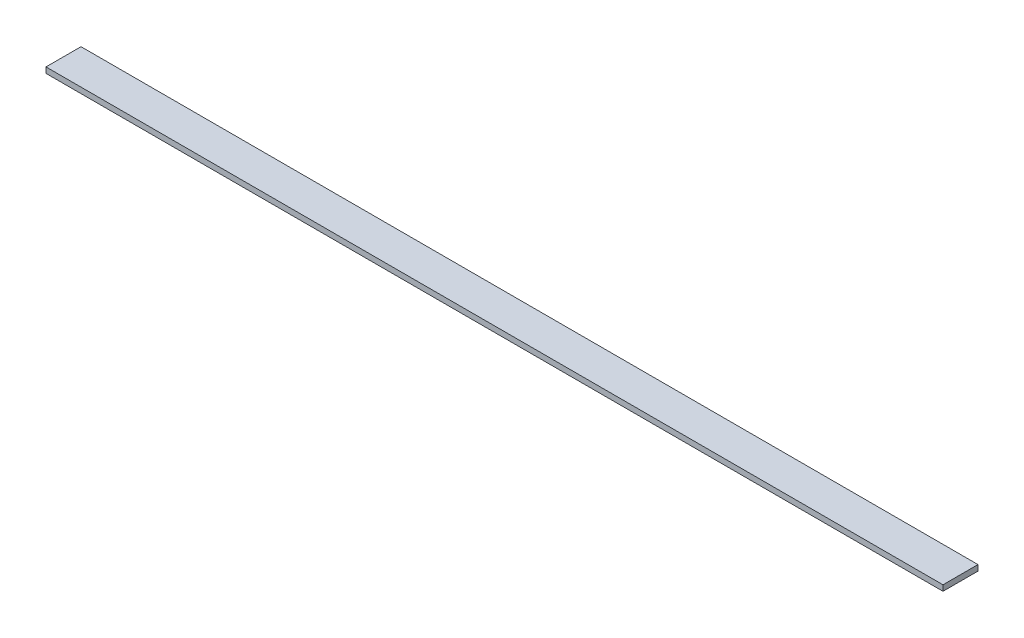
ISO-10303-21;
HEADER;
FILE_DESCRIPTION(('STEP AP214'),'2;1');
FILE_NAME('part.step','',(''),(''),'','','');
FILE_SCHEMA(('AUTOMOTIVE_DESIGN { 1 0 10303 214 1 1 1 1 }'));
ENDSEC;
DATA;
#1=APPLICATION_CONTEXT('core data for automotive mechanical design processes');
#2=APPLICATION_PROTOCOL_DEFINITION('international standard','automotive_design',2000,#1);
#3=PRODUCT_CONTEXT('',#1,'mechanical');
#4=PRODUCT('Part','Part','',(#3));
#5=PRODUCT_RELATED_PRODUCT_CATEGORY('part','',(#4));
#6=PRODUCT_DEFINITION_FORMATION('','',#4);
#7=PRODUCT_DEFINITION_CONTEXT('part definition',#1,'design');
#8=PRODUCT_DEFINITION('design','',#6,#7);
#9=PRODUCT_DEFINITION_SHAPE('','',#8);
#10=(LENGTH_UNIT() NAMED_UNIT(*) SI_UNIT(.MILLI.,.METRE.));
#11=(NAMED_UNIT(*) PLANE_ANGLE_UNIT() SI_UNIT($,.RADIAN.));
#12=(NAMED_UNIT(*) SI_UNIT($,.STERADIAN.) SOLID_ANGLE_UNIT());
#13=UNCERTAINTY_MEASURE_WITH_UNIT(LENGTH_MEASURE(1.E-05),#10,'distance_accuracy_value','');
#14=(GEOMETRIC_REPRESENTATION_CONTEXT(3) GLOBAL_UNCERTAINTY_ASSIGNED_CONTEXT((#13)) GLOBAL_UNIT_ASSIGNED_CONTEXT((#10,
#11,#12)) REPRESENTATION_CONTEXT('',''));
#15=CARTESIAN_POINT('',(0.,0.,0.));
#16=DIRECTION('',(0.,0.,1.));
#17=DIRECTION('',(1.,0.,0.));
#18=AXIS2_PLACEMENT_3D('',#15,#16,#17);
#19=CARTESIAN_POINT('',(-3811.4111111111,38.1,-1664.22916666666));
#20=DIRECTION('',(1.,0.,0.));
#21=DIRECTION('',(0.,0.,-1.));
#22=AXIS2_PLACEMENT_3D('',#19,#20,#21);
#23=PLANE('',#22);
#24=DIRECTION('',(0.,0.,1.));
#25=VECTOR('',#24,1.);
#26=CARTESIAN_POINT('',(-3811.4111111111,0.,-1664.22916666666));
#27=LINE('',#26,#25);
#28=CARTESIAN_POINT('',(-3811.4111111111,0.,-1664.22916666666));
#29=VERTEX_POINT('',#28);
#30=CARTESIAN_POINT('',(-3811.4111111111,0.,-1429.27916666666));
#31=VERTEX_POINT('',#30);
#32=EDGE_CURVE('E96',#29,#31,#27,.T.);
#33=ORIENTED_EDGE('',*,*,#32,.T.);
#34=DIRECTION('',(0.,-1.,0.));
#35=VECTOR('',#34,1.);
#36=CARTESIAN_POINT('',(-3811.4111111111,38.1,-1429.27916666666));
#37=LINE('',#36,#35);
#38=CARTESIAN_POINT('',(-3811.4111111111,38.1,-1429.27916666666));
#39=VERTEX_POINT('',#38);
#40=EDGE_CURVE('E11',#39,#31,#37,.T.);
#41=ORIENTED_EDGE('',*,*,#40,.F.);
#42=DIRECTION('',(0.,0.,1.));
#43=VECTOR('',#42,1.);
#44=CARTESIAN_POINT('',(-3811.4111111111,38.1,-1664.22916666666));
#45=LINE('',#44,#43);
#46=CARTESIAN_POINT('',(-3811.4111111111,38.1,-1664.22916666666));
#47=VERTEX_POINT('',#46);
#48=EDGE_CURVE('E84',#47,#39,#45,.T.);
#49=ORIENTED_EDGE('',*,*,#48,.F.);
#50=DIRECTION('',(0.,-1.,0.));
#51=VECTOR('',#50,1.);
#52=CARTESIAN_POINT('',(-3811.4111111111,38.1,-1664.22916666666));
#53=LINE('',#52,#51);
#54=EDGE_CURVE('E92',#47,#29,#53,.T.);
#55=ORIENTED_EDGE('',*,*,#54,.T.);
#56=EDGE_LOOP('',(#33,#41,#49,#55));
#57=FACE_BOUND('',#56,.T.);
#58=ADVANCED_FACE('F33',(#57),#23,.F.);
#59=CARTESIAN_POINT('',(-3811.4111111111,38.1,-1429.27916666666));
#60=DIRECTION('',(0.,0.,-1.));
#61=DIRECTION('',(-1.,0.,0.));
#62=AXIS2_PLACEMENT_3D('',#59,#60,#61);
#63=PLANE('',#62);
#64=DIRECTION('',(1.,0.,0.));
#65=VECTOR('',#64,1.);
#66=CARTESIAN_POINT('',(-3811.4111111111,0.,-1429.27916666666));
#67=LINE('',#66,#65);
#68=CARTESIAN_POINT('',(2208.3888888889,0.,-1429.27916666666));
#69=VERTEX_POINT('',#68);
#70=EDGE_CURVE('E88',#31,#69,#67,.T.);
#71=ORIENTED_EDGE('',*,*,#70,.T.);
#72=DIRECTION('',(0.,-1.,0.));
#73=VECTOR('',#72,1.);
#74=CARTESIAN_POINT('',(2208.3888888889,38.1,-1429.27916666666));
#75=LINE('',#74,#73);
#76=CARTESIAN_POINT('',(2208.3888888889,38.1,-1429.27916666666));
#77=VERTEX_POINT('',#76);
#78=EDGE_CURVE('E41',#77,#69,#75,.T.);
#79=ORIENTED_EDGE('',*,*,#78,.F.);
#80=DIRECTION('',(1.,0.,0.));
#81=VECTOR('',#80,1.);
#82=CARTESIAN_POINT('',(-3811.4111111111,38.1,-1429.27916666666));
#83=LINE('',#82,#81);
#84=EDGE_CURVE('E79',#39,#77,#83,.T.);
#85=ORIENTED_EDGE('',*,*,#84,.F.);
#86=ORIENTED_EDGE('',*,*,#40,.T.);
#87=EDGE_LOOP('',(#71,#79,#85,#86));
#88=FACE_BOUND('',#87,.T.);
#89=ADVANCED_FACE('F87',(#88),#63,.F.);
#90=CARTESIAN_POINT('',(2208.3888888889,38.1,-1664.22916666666));
#91=DIRECTION('',(-1.,0.,0.));
#92=DIRECTION('',(0.,0.,1.));
#93=AXIS2_PLACEMENT_3D('',#90,#91,#92);
#94=PLANE('',#93);
#95=DIRECTION('',(0.,0.,-1.));
#96=VECTOR('',#95,1.);
#97=CARTESIAN_POINT('',(2208.3888888889,0.,-1664.22916666666));
#98=LINE('',#97,#96);
#99=CARTESIAN_POINT('',(2208.3888888889,0.,-1664.22916666666));
#100=VERTEX_POINT('',#99);
#101=EDGE_CURVE('E66',#69,#100,#98,.T.);
#102=ORIENTED_EDGE('',*,*,#101,.T.);
#103=DIRECTION('',(0.,-1.,0.));
#104=VECTOR('',#103,1.);
#105=CARTESIAN_POINT('',(2208.3888888889,38.1,-1664.22916666666));
#106=LINE('',#105,#104);
#107=CARTESIAN_POINT('',(2208.3888888889,38.1,-1664.22916666666));
#108=VERTEX_POINT('',#107);
#109=EDGE_CURVE('E89',#108,#100,#106,.T.);
#110=ORIENTED_EDGE('',*,*,#109,.F.);
#111=DIRECTION('',(0.,0.,-1.));
#112=VECTOR('',#111,1.);
#113=CARTESIAN_POINT('',(2208.3888888889,38.1,-1664.22916666666));
#114=LINE('',#113,#112);
#115=EDGE_CURVE('E82',#77,#108,#114,.T.);
#116=ORIENTED_EDGE('',*,*,#115,.F.);
#117=ORIENTED_EDGE('',*,*,#78,.T.);
#118=EDGE_LOOP('',(#102,#110,#116,#117));
#119=FACE_BOUND('',#118,.T.);
#120=ADVANCED_FACE('F90',(#119),#94,.F.);
#121=CARTESIAN_POINT('',(-3811.4111111111,38.1,-1664.22916666666));
#122=DIRECTION('',(0.,0.,1.));
#123=DIRECTION('',(1.,0.,0.));
#124=AXIS2_PLACEMENT_3D('',#121,#122,#123);
#125=PLANE('',#124);
#126=DIRECTION('',(-1.,0.,0.));
#127=VECTOR('',#126,1.);
#128=CARTESIAN_POINT('',(-3811.4111111111,0.,-1664.22916666666));
#129=LINE('',#128,#127);
#130=EDGE_CURVE('E72',#100,#29,#129,.T.);
#131=ORIENTED_EDGE('',*,*,#130,.T.);
#132=ORIENTED_EDGE('',*,*,#54,.F.);
#133=DIRECTION('',(-1.,0.,0.));
#134=VECTOR('',#133,1.);
#135=CARTESIAN_POINT('',(-3811.4111111111,38.1,-1664.22916666666));
#136=LINE('',#135,#134);
#137=EDGE_CURVE('E49',#108,#47,#136,.T.);
#138=ORIENTED_EDGE('',*,*,#137,.F.);
#139=ORIENTED_EDGE('',*,*,#109,.T.);
#140=EDGE_LOOP('',(#131,#132,#138,#139));
#141=FACE_BOUND('',#140,.T.);
#142=ADVANCED_FACE('F103',(#141),#125,.F.);
#143=CARTESIAN_POINT('',(0.,38.1,0.));
#144=DIRECTION('',(0.,1.,0.));
#145=DIRECTION('',(0.,0.,1.));
#146=AXIS2_PLACEMENT_3D('',#143,#144,#145);
#147=PLANE('',#146);
#148=ORIENTED_EDGE('',*,*,#48,.T.);
#149=ORIENTED_EDGE('',*,*,#84,.T.);
#150=ORIENTED_EDGE('',*,*,#115,.T.);
#151=ORIENTED_EDGE('',*,*,#137,.T.);
#152=EDGE_LOOP('',(#148,#149,#150,#151));
#153=FACE_BOUND('',#152,.T.);
#154=ADVANCED_FACE('F80',(#153),#147,.T.);
#155=CARTESIAN_POINT('',(0.,0.,0.));
#156=DIRECTION('',(0.,1.,0.));
#157=DIRECTION('',(0.,0.,1.));
#158=AXIS2_PLACEMENT_3D('',#155,#156,#157);
#159=PLANE('',#158);
#160=ORIENTED_EDGE('',*,*,#32,.F.);
#161=ORIENTED_EDGE('',*,*,#130,.F.);
#162=ORIENTED_EDGE('',*,*,#101,.F.);
#163=ORIENTED_EDGE('',*,*,#70,.F.);
#164=EDGE_LOOP('',(#160,#161,#162,#163));
#165=FACE_BOUND('',#164,.T.);
#166=ADVANCED_FACE('F106',(#165),#159,.F.);
#167=CLOSED_SHELL('',(#58,#89,#120,#142,#154,#166));
#168=MANIFOLD_SOLID_BREP('B2',#167);
#169=ADVANCED_BREP_SHAPE_REPRESENTATION('',(#18,#168),#14);
#170=SHAPE_DEFINITION_REPRESENTATION(#9,#169);
ENDSEC;
END-ISO-10303-21;
